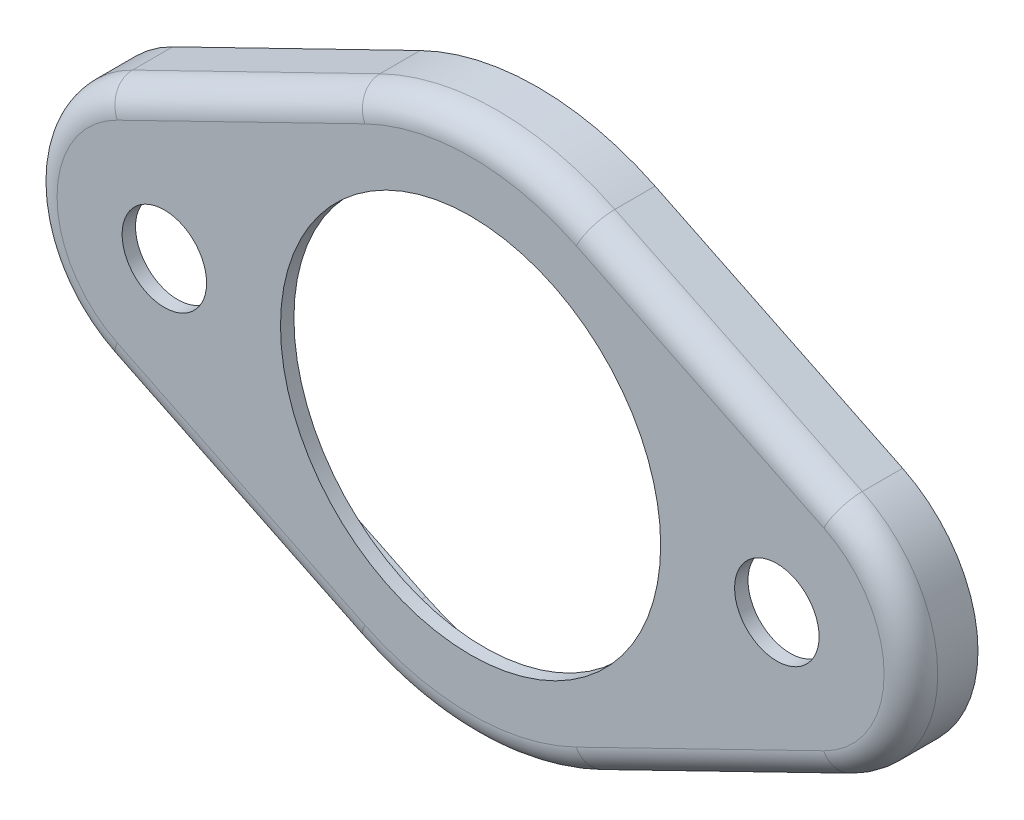
ISO-10303-21;
HEADER;
FILE_DESCRIPTION(('STEP AP214'),'2;1');
FILE_NAME('part.step','',(''),(''),'','','');
FILE_SCHEMA(('AUTOMOTIVE_DESIGN { 1 0 10303 214 1 1 1 1 }'));
ENDSEC;
DATA;
#1=APPLICATION_CONTEXT('core data for automotive mechanical design processes');
#2=APPLICATION_PROTOCOL_DEFINITION('international standard','automotive_design',2000,#1);
#3=PRODUCT_CONTEXT('',#1,'mechanical');
#4=PRODUCT('Part','Part','',(#3));
#5=PRODUCT_RELATED_PRODUCT_CATEGORY('part','',(#4));
#6=PRODUCT_DEFINITION_FORMATION('','',#4);
#7=PRODUCT_DEFINITION_CONTEXT('part definition',#1,'design');
#8=PRODUCT_DEFINITION('design','',#6,#7);
#9=PRODUCT_DEFINITION_SHAPE('','',#8);
#10=(LENGTH_UNIT() NAMED_UNIT(*) SI_UNIT(.MILLI.,.METRE.));
#11=(NAMED_UNIT(*) PLANE_ANGLE_UNIT() SI_UNIT($,.RADIAN.));
#12=(NAMED_UNIT(*) SI_UNIT($,.STERADIAN.) SOLID_ANGLE_UNIT());
#13=UNCERTAINTY_MEASURE_WITH_UNIT(LENGTH_MEASURE(1.E-05),#10,'distance_accuracy_value','');
#14=(GEOMETRIC_REPRESENTATION_CONTEXT(3) GLOBAL_UNCERTAINTY_ASSIGNED_CONTEXT((#13)) GLOBAL_UNIT_ASSIGNED_CONTEXT((#10,
#11,#12)) REPRESENTATION_CONTEXT('',''));
#15=CARTESIAN_POINT('',(0.,0.,0.));
#16=DIRECTION('',(0.,0.,1.));
#17=DIRECTION('',(1.,0.,0.));
#18=AXIS2_PLACEMENT_3D('',#15,#16,#17);
#19=CARTESIAN_POINT('',(-29.,0.,6.35));
#20=DIRECTION('',(0.,0.,-1.));
#21=DIRECTION('',(-1.,0.,0.));
#22=AXIS2_PLACEMENT_3D('',#19,#20,#21);
#23=CYLINDRICAL_SURFACE('',#22,4.);
#24=CARTESIAN_POINT('',(-29.,0.,6.35));
#25=DIRECTION('',(0.,0.,1.));
#26=DIRECTION('',(1.,0.,0.));
#27=AXIS2_PLACEMENT_3D('',#24,#25,#26);
#28=CIRCLE('',#27,4.);
#29=CARTESIAN_POINT('',(-25.,0.,6.35));
#30=VERTEX_POINT('',#29);
#31=EDGE_CURVE('E261',#30,#30,#28,.T.);
#32=ORIENTED_EDGE('',*,*,#31,.T.);
#33=EDGE_LOOP('',(#32));
#34=FACE_BOUND('',#33,.T.);
#35=CARTESIAN_POINT('',(-29.,0.,5.08));
#36=DIRECTION('',(0.,0.,-1.));
#37=DIRECTION('',(-1.,0.,0.));
#38=AXIS2_PLACEMENT_3D('',#35,#36,#37);
#39=CIRCLE('',#38,4.);
#40=CARTESIAN_POINT('',(-33.,0.,5.08));
#41=VERTEX_POINT('',#40);
#42=EDGE_CURVE('E252',#41,#41,#39,.T.);
#43=ORIENTED_EDGE('',*,*,#42,.T.);
#44=EDGE_LOOP('',(#43));
#45=FACE_BOUND('',#44,.T.);
#46=ADVANCED_FACE('F38',(#34,#45),#23,.F.);
#47=CARTESIAN_POINT('',(29.,0.,6.35));
#48=DIRECTION('',(0.,0.,-1.));
#49=DIRECTION('',(-1.,0.,0.));
#50=AXIS2_PLACEMENT_3D('',#47,#48,#49);
#51=CYLINDRICAL_SURFACE('',#50,4.);
#52=CARTESIAN_POINT('',(29.,0.,6.35));
#53=DIRECTION('',(0.,0.,1.));
#54=DIRECTION('',(1.,0.,0.));
#55=AXIS2_PLACEMENT_3D('',#52,#53,#54);
#56=CIRCLE('',#55,4.);
#57=CARTESIAN_POINT('',(33.,0.,6.35));
#58=VERTEX_POINT('',#57);
#59=EDGE_CURVE('E258',#58,#58,#56,.T.);
#60=ORIENTED_EDGE('',*,*,#59,.T.);
#61=EDGE_LOOP('',(#60));
#62=FACE_BOUND('',#61,.T.);
#63=CARTESIAN_POINT('',(29.,0.,5.08));
#64=DIRECTION('',(0.,0.,-1.));
#65=DIRECTION('',(-1.,0.,0.));
#66=AXIS2_PLACEMENT_3D('',#63,#64,#65);
#67=CIRCLE('',#66,4.);
#68=CARTESIAN_POINT('',(25.,0.,5.08));
#69=VERTEX_POINT('',#68);
#70=EDGE_CURVE('E249',#69,#69,#67,.T.);
#71=ORIENTED_EDGE('',*,*,#70,.T.);
#72=EDGE_LOOP('',(#71));
#73=FACE_BOUND('',#72,.T.);
#74=ADVANCED_FACE('F479',(#62,#73),#51,.F.);
#75=CARTESIAN_POINT('',(0.,0.,6.35));
#76=DIRECTION('',(0.,0.,-1.));
#77=DIRECTION('',(-1.,0.,0.));
#78=AXIS2_PLACEMENT_3D('',#75,#76,#77);
#79=CYLINDRICAL_SURFACE('',#78,18.0000000000007);
#80=CARTESIAN_POINT('',(0.,0.,6.35));
#81=DIRECTION('',(0.,0.,1.));
#82=DIRECTION('',(1.,0.,0.));
#83=AXIS2_PLACEMENT_3D('',#80,#81,#82);
#84=CIRCLE('',#83,18.0000000000007);
#85=CARTESIAN_POINT('',(18.0000000000007,0.,6.35));
#86=VERTEX_POINT('',#85);
#87=EDGE_CURVE('E255',#86,#86,#84,.T.);
#88=ORIENTED_EDGE('',*,*,#87,.T.);
#89=EDGE_LOOP('',(#88));
#90=FACE_BOUND('',#89,.T.);
#91=CARTESIAN_POINT('',(0.,0.,5.08));
#92=DIRECTION('',(0.,0.,-1.));
#93=DIRECTION('',(-1.,0.,0.));
#94=AXIS2_PLACEMENT_3D('',#91,#92,#93);
#95=CIRCLE('',#94,18.0000000000007);
#96=CARTESIAN_POINT('',(-18.0000000000007,0.,5.08));
#97=VERTEX_POINT('',#96);
#98=EDGE_CURVE('E238',#97,#97,#95,.T.);
#99=ORIENTED_EDGE('',*,*,#98,.T.);
#100=EDGE_LOOP('',(#99));
#101=FACE_BOUND('',#100,.T.);
#102=ADVANCED_FACE('F485',(#90,#101),#79,.F.);
#103=CARTESIAN_POINT('',(0.,0.,6.35));
#104=DIRECTION('',(0.,0.,-1.));
#105=DIRECTION('',(-1.,0.,0.));
#106=AXIS2_PLACEMENT_3D('',#103,#104,#105);
#107=PLANE('',#106);
#108=CARTESIAN_POINT('',(29.,0.,6.35));
#109=DIRECTION('',(0.,0.,-1.));
#110=DIRECTION('',(-1.,0.,0.));
#111=AXIS2_PLACEMENT_3D('',#108,#109,#110);
#112=CIRCLE('',#111,10.16);
#113=CARTESIAN_POINT('',(33.4493793103448,-9.13392707178436,6.35));
#114=VERTEX_POINT('',#113);
#115=CARTESIAN_POINT('',(33.4493793103448,9.13392707178437,6.35));
#116=VERTEX_POINT('',#115);
#117=EDGE_CURVE('E318',#114,#116,#112,.F.);
#118=ORIENTED_EDGE('',*,*,#117,.T.);
#119=DIRECTION('',(-0.899008570057517,0.437931034482759,0.));
#120=VECTOR('',#119,1.);
#121=CARTESIAN_POINT('',(10.0111034482759,20.5513359115148,6.35));
#122=LINE('',#121,#120);
#123=CARTESIAN_POINT('',(10.0111034482759,20.5513359115148,6.35));
#124=VERTEX_POINT('',#123);
#125=EDGE_CURVE('E320',#116,#124,#122,.T.);
#126=ORIENTED_EDGE('',*,*,#125,.T.);
#127=CARTESIAN_POINT('',(0.,0.,6.35));
#128=DIRECTION('',(0.,0.,-1.));
#129=DIRECTION('',(-1.,0.,0.));
#130=AXIS2_PLACEMENT_3D('',#127,#128,#129);
#131=CIRCLE('',#130,22.86);
#132=CARTESIAN_POINT('',(-10.0111034482759,20.5513359115148,6.35));
#133=VERTEX_POINT('',#132);
#134=EDGE_CURVE('E304',#124,#133,#131,.F.);
#135=ORIENTED_EDGE('',*,*,#134,.T.);
#136=DIRECTION('',(-0.899008570057517,-0.437931034482759,0.));
#137=VECTOR('',#136,1.);
#138=CARTESIAN_POINT('',(-10.0111034482759,20.5513359115148,6.35));
#139=LINE('',#138,#137);
#140=CARTESIAN_POINT('',(-33.4493793103448,9.13392707178436,6.35));
#141=VERTEX_POINT('',#140);
#142=EDGE_CURVE('E308',#133,#141,#139,.T.);
#143=ORIENTED_EDGE('',*,*,#142,.T.);
#144=CARTESIAN_POINT('',(-29.,0.,6.35));
#145=DIRECTION('',(0.,0.,-1.));
#146=DIRECTION('',(-1.,0.,0.));
#147=AXIS2_PLACEMENT_3D('',#144,#145,#146);
#148=CIRCLE('',#147,10.16);
#149=CARTESIAN_POINT('',(-33.4493793103448,-9.13392707178437,6.35));
#150=VERTEX_POINT('',#149);
#151=EDGE_CURVE('E310',#141,#150,#148,.F.);
#152=ORIENTED_EDGE('',*,*,#151,.T.);
#153=DIRECTION('',(0.899008570057517,-0.437931034482758,0.));
#154=VECTOR('',#153,1.);
#155=CARTESIAN_POINT('',(-10.0111034482759,-20.5513359115148,6.35));
#156=LINE('',#155,#154);
#157=CARTESIAN_POINT('',(-10.0111034482759,-20.5513359115148,6.35));
#158=VERTEX_POINT('',#157);
#159=EDGE_CURVE('E312',#150,#158,#156,.T.);
#160=ORIENTED_EDGE('',*,*,#159,.T.);
#161=CARTESIAN_POINT('',(0.,0.,6.35));
#162=DIRECTION('',(0.,0.,-1.));
#163=DIRECTION('',(-1.,0.,0.));
#164=AXIS2_PLACEMENT_3D('',#161,#162,#163);
#165=CIRCLE('',#164,22.86);
#166=CARTESIAN_POINT('',(10.0111034482759,-20.5513359115148,6.35));
#167=VERTEX_POINT('',#166);
#168=EDGE_CURVE('E314',#158,#167,#165,.F.);
#169=ORIENTED_EDGE('',*,*,#168,.T.);
#170=DIRECTION('',(0.899008570057517,0.437931034482759,0.));
#171=VECTOR('',#170,1.);
#172=CARTESIAN_POINT('',(10.0111034482759,-20.5513359115148,6.35));
#173=LINE('',#172,#171);
#174=EDGE_CURVE('E316',#167,#114,#173,.T.);
#175=ORIENTED_EDGE('',*,*,#174,.T.);
#176=EDGE_LOOP('',(#118,#126,#135,#143,#152,#160,#169,#175));
#177=FACE_BOUND('',#176,.T.);
#178=ORIENTED_EDGE('',*,*,#59,.F.);
#179=EDGE_LOOP('',(#178));
#180=FACE_BOUND('',#179,.T.);
#181=ORIENTED_EDGE('',*,*,#31,.F.);
#182=EDGE_LOOP('',(#181));
#183=FACE_BOUND('',#182,.T.);
#184=ORIENTED_EDGE('',*,*,#87,.F.);
#185=EDGE_LOOP('',(#184));
#186=FACE_BOUND('',#185,.T.);
#187=ADVANCED_FACE('F491',(#177,#180,#183,#186),#107,.F.);
#188=CARTESIAN_POINT('',(0.,0.,0.));
#189=DIRECTION('',(0.,0.,-1.));
#190=DIRECTION('',(-1.,0.,0.));
#191=AXIS2_PLACEMENT_3D('',#188,#189,#190);
#192=PLANE('',#191);
#193=CARTESIAN_POINT('',(0.,0.,0.));
#194=DIRECTION('',(0.,0.,-1.));
#195=DIRECTION('',(-1.,0.,0.));
#196=AXIS2_PLACEMENT_3D('',#193,#194,#195);
#197=CIRCLE('',#196,24.13);
#198=CARTESIAN_POINT('',(-10.567275862069,21.6930767954879,0.));
#199=VERTEX_POINT('',#198);
#200=CARTESIAN_POINT('',(10.567275862069,21.6930767954879,0.));
#201=VERTEX_POINT('',#200);
#202=EDGE_CURVE('E213',#199,#201,#197,.T.);
#203=ORIENTED_EDGE('',*,*,#202,.F.);
#204=DIRECTION('',(0.899008570057517,0.437931034482759,0.));
#205=VECTOR('',#204,1.);
#206=CARTESIAN_POINT('',(-34.0055517241379,10.2756679557574,0.));
#207=LINE('',#206,#205);
#208=CARTESIAN_POINT('',(-34.0055517241379,10.2756679557574,0.));
#209=VERTEX_POINT('',#208);
#210=EDGE_CURVE('E233',#209,#199,#207,.T.);
#211=ORIENTED_EDGE('',*,*,#210,.F.);
#212=CARTESIAN_POINT('',(-29.,0.,0.));
#213=DIRECTION('',(0.,0.,-1.));
#214=DIRECTION('',(-1.,0.,0.));
#215=AXIS2_PLACEMENT_3D('',#212,#213,#214);
#216=CIRCLE('',#215,11.43);
#217=CARTESIAN_POINT('',(-34.0055517241379,-10.2756679557574,0.));
#218=VERTEX_POINT('',#217);
#219=EDGE_CURVE('E230',#218,#209,#216,.T.);
#220=ORIENTED_EDGE('',*,*,#219,.F.);
#221=DIRECTION('',(-0.899008570057517,0.437931034482758,0.));
#222=VECTOR('',#221,1.);
#223=CARTESIAN_POINT('',(-10.567275862069,-21.6930767954879,0.));
#224=LINE('',#223,#222);
#225=CARTESIAN_POINT('',(-10.567275862069,-21.6930767954879,0.));
#226=VERTEX_POINT('',#225);
#227=EDGE_CURVE('E227',#226,#218,#224,.T.);
#228=ORIENTED_EDGE('',*,*,#227,.F.);
#229=CARTESIAN_POINT('',(0.,0.,0.));
#230=DIRECTION('',(0.,0.,-1.));
#231=DIRECTION('',(-1.,0.,0.));
#232=AXIS2_PLACEMENT_3D('',#229,#230,#231);
#233=CIRCLE('',#232,24.13);
#234=CARTESIAN_POINT('',(10.567275862069,-21.6930767954879,0.));
#235=VERTEX_POINT('',#234);
#236=EDGE_CURVE('E221',#235,#226,#233,.T.);
#237=ORIENTED_EDGE('',*,*,#236,.F.);
#238=DIRECTION('',(-0.899008570057517,-0.437931034482758,0.));
#239=VECTOR('',#238,1.);
#240=CARTESIAN_POINT('',(34.0055517241379,-10.2756679557574,0.));
#241=LINE('',#240,#239);
#242=CARTESIAN_POINT('',(34.0055517241379,-10.2756679557574,0.));
#243=VERTEX_POINT('',#242);
#244=EDGE_CURVE('E219',#243,#235,#241,.T.);
#245=ORIENTED_EDGE('',*,*,#244,.F.);
#246=CARTESIAN_POINT('',(29.,0.,0.));
#247=DIRECTION('',(0.,0.,-1.));
#248=DIRECTION('',(-1.,0.,0.));
#249=AXIS2_PLACEMENT_3D('',#246,#247,#248);
#250=CIRCLE('',#249,11.43);
#251=CARTESIAN_POINT('',(34.0055517241379,10.2756679557574,0.));
#252=VERTEX_POINT('',#251);
#253=EDGE_CURVE('E202',#252,#243,#250,.T.);
#254=ORIENTED_EDGE('',*,*,#253,.F.);
#255=DIRECTION('',(0.899008570057517,-0.437931034482759,0.));
#256=VECTOR('',#255,1.);
#257=CARTESIAN_POINT('',(10.567275862069,21.6930767954879,0.));
#258=LINE('',#257,#256);
#259=EDGE_CURVE('E208',#201,#252,#258,.T.);
#260=ORIENTED_EDGE('',*,*,#259,.F.);
#261=EDGE_LOOP('',(#203,#211,#220,#228,#237,#245,#254,#260));
#262=FACE_BOUND('',#261,.T.);
#263=CARTESIAN_POINT('',(0.,0.,0.));
#264=DIRECTION('',(0.,0.,1.));
#265=DIRECTION('',(-1.,0.,0.));
#266=AXIS2_PLACEMENT_3D('',#263,#264,#265);
#267=CIRCLE('',#266,25.4);
#268=CARTESIAN_POINT('',(11.1234482758621,22.8348176794609,0.));
#269=VERTEX_POINT('',#268);
#270=CARTESIAN_POINT('',(-11.1234482758621,22.8348176794609,0.));
#271=VERTEX_POINT('',#270);
#272=EDGE_CURVE('E264',#269,#271,#267,.T.);
#273=ORIENTED_EDGE('',*,*,#272,.F.);
#274=DIRECTION('',(-0.899008570057517,0.437931034482758,0.));
#275=VECTOR('',#274,1.);
#276=CARTESIAN_POINT('',(11.1234482758621,22.8348176794609,0.));
#277=LINE('',#276,#275);
#278=CARTESIAN_POINT('',(34.561724137931,11.4174088397305,0.));
#279=VERTEX_POINT('',#278);
#280=EDGE_CURVE('E285',#279,#269,#277,.T.);
#281=ORIENTED_EDGE('',*,*,#280,.F.);
#282=CARTESIAN_POINT('',(29.,0.,0.));
#283=DIRECTION('',(0.,0.,1.));
#284=DIRECTION('',(-1.,0.,0.));
#285=AXIS2_PLACEMENT_3D('',#282,#283,#284);
#286=CIRCLE('',#285,12.7);
#287=CARTESIAN_POINT('',(34.561724137931,-11.4174088397305,0.));
#288=VERTEX_POINT('',#287);
#289=EDGE_CURVE('E282',#288,#279,#286,.T.);
#290=ORIENTED_EDGE('',*,*,#289,.F.);
#291=DIRECTION('',(0.899008570057517,0.437931034482759,0.));
#292=VECTOR('',#291,1.);
#293=CARTESIAN_POINT('',(34.561724137931,-11.4174088397305,0.));
#294=LINE('',#293,#292);
#295=CARTESIAN_POINT('',(11.1234482758621,-22.8348176794609,0.));
#296=VERTEX_POINT('',#295);
#297=EDGE_CURVE('E279',#296,#288,#294,.T.);
#298=ORIENTED_EDGE('',*,*,#297,.F.);
#299=CARTESIAN_POINT('',(0.,0.,0.));
#300=DIRECTION('',(0.,0.,1.));
#301=DIRECTION('',(1.,0.,0.));
#302=AXIS2_PLACEMENT_3D('',#299,#300,#301);
#303=CIRCLE('',#302,25.4);
#304=CARTESIAN_POINT('',(-11.1234482758621,-22.8348176794609,0.));
#305=VERTEX_POINT('',#304);
#306=EDGE_CURVE('E276',#305,#296,#303,.T.);
#307=ORIENTED_EDGE('',*,*,#306,.F.);
#308=DIRECTION('',(0.899008570057517,-0.437931034482758,0.));
#309=VECTOR('',#308,1.);
#310=CARTESIAN_POINT('',(-11.1234482758621,-22.8348176794609,0.));
#311=LINE('',#310,#309);
#312=CARTESIAN_POINT('',(-34.561724137931,-11.4174088397305,0.));
#313=VERTEX_POINT('',#312);
#314=EDGE_CURVE('E273',#313,#305,#311,.T.);
#315=ORIENTED_EDGE('',*,*,#314,.F.);
#316=CARTESIAN_POINT('',(-29.,0.,0.));
#317=DIRECTION('',(0.,0.,1.));
#318=DIRECTION('',(1.,0.,0.));
#319=AXIS2_PLACEMENT_3D('',#316,#317,#318);
#320=CIRCLE('',#319,12.7);
#321=CARTESIAN_POINT('',(-34.561724137931,11.4174088397305,0.));
#322=VERTEX_POINT('',#321);
#323=EDGE_CURVE('E270',#322,#313,#320,.T.);
#324=ORIENTED_EDGE('',*,*,#323,.F.);
#325=DIRECTION('',(-0.899008570057517,-0.437931034482759,0.));
#326=VECTOR('',#325,1.);
#327=CARTESIAN_POINT('',(-34.561724137931,11.4174088397305,0.));
#328=LINE('',#327,#326);
#329=EDGE_CURVE('E267',#271,#322,#328,.T.);
#330=ORIENTED_EDGE('',*,*,#329,.F.);
#331=EDGE_LOOP('',(#273,#281,#290,#298,#307,#315,#324,#330));
#332=FACE_BOUND('',#331,.T.);
#333=ADVANCED_FACE('F215',(#262,#332),#192,.T.);
#334=CARTESIAN_POINT('',(0.,0.,6.35));
#335=DIRECTION('',(0.,0.,-1.));
#336=DIRECTION('',(-1.,0.,0.));
#337=AXIS2_PLACEMENT_3D('',#334,#335,#336);
#338=CYLINDRICAL_SURFACE('',#337,25.4);
#339=DIRECTION('',(0.,0.,-1.));
#340=VECTOR('',#339,1.);
#341=CARTESIAN_POINT('',(-11.1234482758621,22.8348176794609,6.35));
#342=LINE('',#341,#340);
#343=CARTESIAN_POINT('',(-11.1234482758621,22.8348176794609,3.81));
#344=VERTEX_POINT('',#343);
#345=EDGE_CURVE('E302',#344,#271,#342,.T.);
#346=ORIENTED_EDGE('',*,*,#345,.F.);
#347=CARTESIAN_POINT('',(0.,0.,3.81));
#348=DIRECTION('',(0.,0.,-1.));
#349=DIRECTION('',(-1.,0.,0.));
#350=AXIS2_PLACEMENT_3D('',#347,#348,#349);
#351=CIRCLE('',#350,25.4);
#352=CARTESIAN_POINT('',(11.1234482758621,22.8348176794609,3.81));
#353=VERTEX_POINT('',#352);
#354=EDGE_CURVE('E47',#344,#353,#351,.T.);
#355=ORIENTED_EDGE('',*,*,#354,.T.);
#356=DIRECTION('',(0.,0.,-1.));
#357=VECTOR('',#356,1.);
#358=CARTESIAN_POINT('',(11.1234482758621,22.8348176794609,6.35));
#359=LINE('',#358,#357);
#360=EDGE_CURVE('E288',#353,#269,#359,.T.);
#361=ORIENTED_EDGE('',*,*,#360,.T.);
#362=ORIENTED_EDGE('',*,*,#272,.T.);
#363=EDGE_LOOP('',(#346,#355,#361,#362));
#364=FACE_BOUND('',#363,.T.);
#365=ADVANCED_FACE('F497',(#364),#338,.T.);
#366=CARTESIAN_POINT('',(-34.561724137931,11.4174088397305,6.35));
#367=DIRECTION('',(0.437931034482759,-0.899008570057517,0.));
#368=DIRECTION('',(0.899008570057517,0.437931034482759,0.));
#369=AXIS2_PLACEMENT_3D('',#366,#367,#368);
#370=PLANE('',#369);
#371=DIRECTION('',(0.,0.,-1.));
#372=VECTOR('',#371,1.);
#373=CARTESIAN_POINT('',(-34.561724137931,11.4174088397305,6.35));
#374=LINE('',#373,#372);
#375=CARTESIAN_POINT('',(-34.561724137931,11.4174088397305,3.81));
#376=VERTEX_POINT('',#375);
#377=EDGE_CURVE('E300',#376,#322,#374,.T.);
#378=ORIENTED_EDGE('',*,*,#377,.F.);
#379=DIRECTION('',(-0.899008570057517,-0.437931034482759,0.));
#380=VECTOR('',#379,1.);
#381=CARTESIAN_POINT('',(-34.561724137931,11.4174088397305,3.81));
#382=LINE('',#381,#380);
#383=EDGE_CURVE('E336',#376,#344,#382,.F.);
#384=ORIENTED_EDGE('',*,*,#383,.T.);
#385=ORIENTED_EDGE('',*,*,#345,.T.);
#386=ORIENTED_EDGE('',*,*,#329,.T.);
#387=EDGE_LOOP('',(#378,#384,#385,#386));
#388=FACE_BOUND('',#387,.T.);
#389=ADVANCED_FACE('F521',(#388),#370,.F.);
#390=CARTESIAN_POINT('',(-29.,0.,6.35));
#391=DIRECTION('',(0.,0.,-1.));
#392=DIRECTION('',(-1.,0.,0.));
#393=AXIS2_PLACEMENT_3D('',#390,#391,#392);
#394=CYLINDRICAL_SURFACE('',#393,12.7);
#395=DIRECTION('',(0.,0.,-1.));
#396=VECTOR('',#395,1.);
#397=CARTESIAN_POINT('',(-34.561724137931,-11.4174088397305,6.35));
#398=LINE('',#397,#396);
#399=CARTESIAN_POINT('',(-34.561724137931,-11.4174088397305,3.81));
#400=VERTEX_POINT('',#399);
#401=EDGE_CURVE('E298',#400,#313,#398,.T.);
#402=ORIENTED_EDGE('',*,*,#401,.F.);
#403=CARTESIAN_POINT('',(-29.,0.,3.81));
#404=DIRECTION('',(0.,0.,-1.));
#405=DIRECTION('',(-1.,0.,0.));
#406=AXIS2_PLACEMENT_3D('',#403,#404,#405);
#407=CIRCLE('',#406,12.7);
#408=EDGE_CURVE('E334',#400,#376,#407,.T.);
#409=ORIENTED_EDGE('',*,*,#408,.T.);
#410=ORIENTED_EDGE('',*,*,#377,.T.);
#411=ORIENTED_EDGE('',*,*,#323,.T.);
#412=EDGE_LOOP('',(#402,#409,#410,#411));
#413=FACE_BOUND('',#412,.T.);
#414=ADVANCED_FACE('F517',(#413),#394,.T.);
#415=CARTESIAN_POINT('',(-11.1234482758621,-22.8348176794609,6.35));
#416=DIRECTION('',(0.437931034482758,0.899008570057517,0.));
#417=DIRECTION('',(-0.899008570057517,0.437931034482758,0.));
#418=AXIS2_PLACEMENT_3D('',#415,#416,#417);
#419=PLANE('',#418);
#420=DIRECTION('',(0.,0.,-1.));
#421=VECTOR('',#420,1.);
#422=CARTESIAN_POINT('',(-11.1234482758621,-22.8348176794609,6.35));
#423=LINE('',#422,#421);
#424=CARTESIAN_POINT('',(-11.1234482758621,-22.8348176794609,3.81));
#425=VERTEX_POINT('',#424);
#426=EDGE_CURVE('E296',#425,#305,#423,.T.);
#427=ORIENTED_EDGE('',*,*,#426,.F.);
#428=DIRECTION('',(0.899008570057517,-0.437931034482758,0.));
#429=VECTOR('',#428,1.);
#430=CARTESIAN_POINT('',(-11.1234482758621,-22.8348176794609,3.81));
#431=LINE('',#430,#429);
#432=EDGE_CURVE('E332',#425,#400,#431,.F.);
#433=ORIENTED_EDGE('',*,*,#432,.T.);
#434=ORIENTED_EDGE('',*,*,#401,.T.);
#435=ORIENTED_EDGE('',*,*,#314,.T.);
#436=EDGE_LOOP('',(#427,#433,#434,#435));
#437=FACE_BOUND('',#436,.T.);
#438=ADVANCED_FACE('F513',(#437),#419,.F.);
#439=CARTESIAN_POINT('',(0.,0.,6.35));
#440=DIRECTION('',(0.,0.,-1.));
#441=DIRECTION('',(-1.,0.,0.));
#442=AXIS2_PLACEMENT_3D('',#439,#440,#441);
#443=CYLINDRICAL_SURFACE('',#442,25.4);
#444=DIRECTION('',(0.,0.,-1.));
#445=VECTOR('',#444,1.);
#446=CARTESIAN_POINT('',(11.1234482758621,-22.8348176794609,6.35));
#447=LINE('',#446,#445);
#448=CARTESIAN_POINT('',(11.1234482758621,-22.8348176794609,3.81));
#449=VERTEX_POINT('',#448);
#450=EDGE_CURVE('E294',#449,#296,#447,.T.);
#451=ORIENTED_EDGE('',*,*,#450,.F.);
#452=CARTESIAN_POINT('',(0.,0.,3.81));
#453=DIRECTION('',(0.,0.,-1.));
#454=DIRECTION('',(-1.,0.,0.));
#455=AXIS2_PLACEMENT_3D('',#452,#453,#454);
#456=CIRCLE('',#455,25.4);
#457=EDGE_CURVE('E330',#449,#425,#456,.T.);
#458=ORIENTED_EDGE('',*,*,#457,.T.);
#459=ORIENTED_EDGE('',*,*,#426,.T.);
#460=ORIENTED_EDGE('',*,*,#306,.T.);
#461=EDGE_LOOP('',(#451,#458,#459,#460));
#462=FACE_BOUND('',#461,.T.);
#463=ADVANCED_FACE('F509',(#462),#443,.T.);
#464=CARTESIAN_POINT('',(34.561724137931,-11.4174088397305,6.35));
#465=DIRECTION('',(-0.437931034482759,0.899008570057517,0.));
#466=DIRECTION('',(-0.899008570057517,-0.437931034482759,0.));
#467=AXIS2_PLACEMENT_3D('',#464,#465,#466);
#468=PLANE('',#467);
#469=DIRECTION('',(0.,0.,-1.));
#470=VECTOR('',#469,1.);
#471=CARTESIAN_POINT('',(34.561724137931,-11.4174088397305,6.35));
#472=LINE('',#471,#470);
#473=CARTESIAN_POINT('',(34.561724137931,-11.4174088397305,3.81));
#474=VERTEX_POINT('',#473);
#475=EDGE_CURVE('E292',#474,#288,#472,.T.);
#476=ORIENTED_EDGE('',*,*,#475,.F.);
#477=DIRECTION('',(0.899008570057517,0.437931034482759,0.));
#478=VECTOR('',#477,1.);
#479=CARTESIAN_POINT('',(34.561724137931,-11.4174088397305,3.81));
#480=LINE('',#479,#478);
#481=EDGE_CURVE('E328',#474,#449,#480,.F.);
#482=ORIENTED_EDGE('',*,*,#481,.T.);
#483=ORIENTED_EDGE('',*,*,#450,.T.);
#484=ORIENTED_EDGE('',*,*,#297,.T.);
#485=EDGE_LOOP('',(#476,#482,#483,#484));
#486=FACE_BOUND('',#485,.T.);
#487=ADVANCED_FACE('F505',(#486),#468,.F.);
#488=CARTESIAN_POINT('',(29.,0.,6.35));
#489=DIRECTION('',(0.,0.,-1.));
#490=DIRECTION('',(-1.,0.,0.));
#491=AXIS2_PLACEMENT_3D('',#488,#489,#490);
#492=CYLINDRICAL_SURFACE('',#491,12.7);
#493=DIRECTION('',(0.,0.,-1.));
#494=VECTOR('',#493,1.);
#495=CARTESIAN_POINT('',(34.561724137931,11.4174088397305,6.35));
#496=LINE('',#495,#494);
#497=CARTESIAN_POINT('',(34.561724137931,11.4174088397305,3.81));
#498=VERTEX_POINT('',#497);
#499=EDGE_CURVE('E290',#498,#279,#496,.T.);
#500=ORIENTED_EDGE('',*,*,#499,.F.);
#501=CARTESIAN_POINT('',(29.,0.,3.81));
#502=DIRECTION('',(0.,0.,-1.));
#503=DIRECTION('',(-1.,0.,0.));
#504=AXIS2_PLACEMENT_3D('',#501,#502,#503);
#505=CIRCLE('',#504,12.7);
#506=EDGE_CURVE('E326',#498,#474,#505,.T.);
#507=ORIENTED_EDGE('',*,*,#506,.T.);
#508=ORIENTED_EDGE('',*,*,#475,.T.);
#509=ORIENTED_EDGE('',*,*,#289,.T.);
#510=EDGE_LOOP('',(#500,#507,#508,#509));
#511=FACE_BOUND('',#510,.T.);
#512=ADVANCED_FACE('F501',(#511),#492,.T.);
#513=CARTESIAN_POINT('',(11.1234482758621,22.8348176794609,6.35));
#514=DIRECTION('',(-0.437931034482758,-0.899008570057517,0.));
#515=DIRECTION('',(0.899008570057517,-0.437931034482759,0.));
#516=AXIS2_PLACEMENT_3D('',#513,#514,#515);
#517=PLANE('',#516);
#518=ORIENTED_EDGE('',*,*,#360,.F.);
#519=DIRECTION('',(-0.899008570057517,0.437931034482759,0.));
#520=VECTOR('',#519,1.);
#521=CARTESIAN_POINT('',(11.1234482758621,22.8348176794609,3.81));
#522=LINE('',#521,#520);
#523=EDGE_CURVE('E323',#353,#498,#522,.F.);
#524=ORIENTED_EDGE('',*,*,#523,.T.);
#525=ORIENTED_EDGE('',*,*,#499,.T.);
#526=ORIENTED_EDGE('',*,*,#280,.T.);
#527=EDGE_LOOP('',(#518,#524,#525,#526));
#528=FACE_BOUND('',#527,.T.);
#529=ADVANCED_FACE('F498',(#528),#517,.F.);
#530=CARTESIAN_POINT('',(0.,0.,100.516698997045));
#531=DIRECTION('',(0.,0.,-1.));
#532=DIRECTION('',(-1.,0.,0.));
#533=AXIS2_PLACEMENT_3D('',#530,#531,#532);
#534=CYLINDRICAL_SURFACE('',#533,24.13);
#535=DIRECTION('',(0.,0.,-1.));
#536=VECTOR('',#535,1.);
#537=CARTESIAN_POINT('',(10.567275862069,21.6930767954879,100.516698997045));
#538=LINE('',#537,#536);
#539=CARTESIAN_POINT('',(10.567275862069,21.6930767954879,2.54));
#540=VERTEX_POINT('',#539);
#541=EDGE_CURVE('E205',#540,#201,#538,.T.);
#542=ORIENTED_EDGE('',*,*,#541,.F.);
#543=CARTESIAN_POINT('',(0.,0.,2.54));
#544=DIRECTION('',(0.,0.,-1.));
#545=DIRECTION('',(-1.,0.,0.));
#546=AXIS2_PLACEMENT_3D('',#543,#544,#545);
#547=CIRCLE('',#546,24.13);
#548=CARTESIAN_POINT('',(-10.567275862069,21.6930767954879,2.54));
#549=VERTEX_POINT('',#548);
#550=EDGE_CURVE('E366',#540,#549,#547,.F.);
#551=ORIENTED_EDGE('',*,*,#550,.T.);
#552=DIRECTION('',(0.,0.,-1.));
#553=VECTOR('',#552,1.);
#554=CARTESIAN_POINT('',(-10.567275862069,21.6930767954879,100.516698997045));
#555=LINE('',#554,#553);
#556=EDGE_CURVE('E236',#549,#199,#555,.T.);
#557=ORIENTED_EDGE('',*,*,#556,.T.);
#558=ORIENTED_EDGE('',*,*,#202,.T.);
#559=EDGE_LOOP('',(#542,#551,#557,#558));
#560=FACE_BOUND('',#559,.T.);
#561=ADVANCED_FACE('F457',(#560),#534,.F.);
#562=CARTESIAN_POINT('',(-34.0055517241379,10.2756679557574,100.516698997045));
#563=DIRECTION('',(-0.437931034482759,0.899008570057517,0.));
#564=DIRECTION('',(-0.899008570057517,-0.437931034482759,0.));
#565=AXIS2_PLACEMENT_3D('',#562,#563,#564);
#566=PLANE('',#565);
#567=ORIENTED_EDGE('',*,*,#556,.F.);
#568=DIRECTION('',(-0.899008570057517,-0.437931034482759,0.));
#569=VECTOR('',#568,1.);
#570=CARTESIAN_POINT('',(-34.0055517241379,10.2756679557574,2.54));
#571=LINE('',#570,#569);
#572=CARTESIAN_POINT('',(-34.0055517241379,10.2756679557574,2.54));
#573=VERTEX_POINT('',#572);
#574=EDGE_CURVE('E364',#549,#573,#571,.T.);
#575=ORIENTED_EDGE('',*,*,#574,.T.);
#576=DIRECTION('',(0.,0.,-1.));
#577=VECTOR('',#576,1.);
#578=CARTESIAN_POINT('',(-34.0055517241379,10.2756679557574,100.516698997045));
#579=LINE('',#578,#577);
#580=EDGE_CURVE('E239',#573,#209,#579,.T.);
#581=ORIENTED_EDGE('',*,*,#580,.T.);
#582=ORIENTED_EDGE('',*,*,#210,.T.);
#583=EDGE_LOOP('',(#567,#575,#581,#582));
#584=FACE_BOUND('',#583,.T.);
#585=ADVANCED_FACE('F455',(#584),#566,.F.);
#586=CARTESIAN_POINT('',(-29.,0.,100.516698997045));
#587=DIRECTION('',(0.,0.,-1.));
#588=DIRECTION('',(-1.,0.,0.));
#589=AXIS2_PLACEMENT_3D('',#586,#587,#588);
#590=CYLINDRICAL_SURFACE('',#589,11.43);
#591=ORIENTED_EDGE('',*,*,#580,.F.);
#592=CARTESIAN_POINT('',(-29.,0.,2.54));
#593=DIRECTION('',(0.,0.,-1.));
#594=DIRECTION('',(-1.,0.,0.));
#595=AXIS2_PLACEMENT_3D('',#592,#593,#594);
#596=CIRCLE('',#595,11.43);
#597=CARTESIAN_POINT('',(-34.0055517241379,-10.2756679557574,2.54));
#598=VERTEX_POINT('',#597);
#599=EDGE_CURVE('E362',#573,#598,#596,.F.);
#600=ORIENTED_EDGE('',*,*,#599,.T.);
#601=DIRECTION('',(0.,0.,-1.));
#602=VECTOR('',#601,1.);
#603=CARTESIAN_POINT('',(-34.0055517241379,-10.2756679557574,100.516698997045));
#604=LINE('',#603,#602);
#605=EDGE_CURVE('E241',#598,#218,#604,.T.);
#606=ORIENTED_EDGE('',*,*,#605,.T.);
#607=ORIENTED_EDGE('',*,*,#219,.T.);
#608=EDGE_LOOP('',(#591,#600,#606,#607));
#609=FACE_BOUND('',#608,.T.);
#610=ADVANCED_FACE('F452',(#609),#590,.F.);
#611=CARTESIAN_POINT('',(-10.567275862069,-21.6930767954879,100.516698997045));
#612=DIRECTION('',(-0.437931034482758,-0.899008570057517,0.));
#613=DIRECTION('',(0.899008570057517,-0.437931034482758,0.));
#614=AXIS2_PLACEMENT_3D('',#611,#612,#613);
#615=PLANE('',#614);
#616=ORIENTED_EDGE('',*,*,#605,.F.);
#617=DIRECTION('',(0.899008570057517,-0.437931034482758,0.));
#618=VECTOR('',#617,1.);
#619=CARTESIAN_POINT('',(-10.567275862069,-21.6930767954879,2.54));
#620=LINE('',#619,#618);
#621=CARTESIAN_POINT('',(-10.567275862069,-21.6930767954879,2.54));
#622=VERTEX_POINT('',#621);
#623=EDGE_CURVE('E360',#598,#622,#620,.T.);
#624=ORIENTED_EDGE('',*,*,#623,.T.);
#625=DIRECTION('',(0.,0.,-1.));
#626=VECTOR('',#625,1.);
#627=CARTESIAN_POINT('',(-10.567275862069,-21.6930767954879,100.516698997045));
#628=LINE('',#627,#626);
#629=EDGE_CURVE('E243',#622,#226,#628,.T.);
#630=ORIENTED_EDGE('',*,*,#629,.T.);
#631=ORIENTED_EDGE('',*,*,#227,.T.);
#632=EDGE_LOOP('',(#616,#624,#630,#631));
#633=FACE_BOUND('',#632,.T.);
#634=ADVANCED_FACE('F449',(#633),#615,.F.);
#635=CARTESIAN_POINT('',(0.,0.,100.516698997045));
#636=DIRECTION('',(0.,0.,-1.));
#637=DIRECTION('',(-1.,0.,0.));
#638=AXIS2_PLACEMENT_3D('',#635,#636,#637);
#639=CYLINDRICAL_SURFACE('',#638,24.13);
#640=ORIENTED_EDGE('',*,*,#629,.F.);
#641=CARTESIAN_POINT('',(0.,0.,2.54));
#642=DIRECTION('',(0.,0.,-1.));
#643=DIRECTION('',(-1.,0.,0.));
#644=AXIS2_PLACEMENT_3D('',#641,#642,#643);
#645=CIRCLE('',#644,24.13);
#646=CARTESIAN_POINT('',(10.567275862069,-21.6930767954879,2.54));
#647=VERTEX_POINT('',#646);
#648=EDGE_CURVE('E358',#622,#647,#645,.F.);
#649=ORIENTED_EDGE('',*,*,#648,.T.);
#650=DIRECTION('',(0.,0.,-1.));
#651=VECTOR('',#650,1.);
#652=CARTESIAN_POINT('',(10.567275862069,-21.6930767954879,100.516698997045));
#653=LINE('',#652,#651);
#654=EDGE_CURVE('E245',#647,#235,#653,.T.);
#655=ORIENTED_EDGE('',*,*,#654,.T.);
#656=ORIENTED_EDGE('',*,*,#236,.T.);
#657=EDGE_LOOP('',(#640,#649,#655,#656));
#658=FACE_BOUND('',#657,.T.);
#659=ADVANCED_FACE('F441',(#658),#639,.F.);
#660=CARTESIAN_POINT('',(34.0055517241379,-10.2756679557574,100.516698997045));
#661=DIRECTION('',(0.437931034482758,-0.899008570057517,0.));
#662=DIRECTION('',(0.899008570057517,0.437931034482758,0.));
#663=AXIS2_PLACEMENT_3D('',#660,#661,#662);
#664=PLANE('',#663);
#665=ORIENTED_EDGE('',*,*,#654,.F.);
#666=DIRECTION('',(0.899008570057517,0.437931034482758,0.));
#667=VECTOR('',#666,1.);
#668=CARTESIAN_POINT('',(34.0055517241379,-10.2756679557574,2.54));
#669=LINE('',#668,#667);
#670=CARTESIAN_POINT('',(34.0055517241379,-10.2756679557574,2.54));
#671=VERTEX_POINT('',#670);
#672=EDGE_CURVE('E338',#647,#671,#669,.T.);
#673=ORIENTED_EDGE('',*,*,#672,.T.);
#674=DIRECTION('',(0.,0.,-1.));
#675=VECTOR('',#674,1.);
#676=CARTESIAN_POINT('',(34.0055517241379,-10.2756679557574,100.516698997045));
#677=LINE('',#676,#675);
#678=EDGE_CURVE('E204',#671,#243,#677,.T.);
#679=ORIENTED_EDGE('',*,*,#678,.T.);
#680=ORIENTED_EDGE('',*,*,#244,.T.);
#681=EDGE_LOOP('',(#665,#673,#679,#680));
#682=FACE_BOUND('',#681,.T.);
#683=ADVANCED_FACE('F443',(#682),#664,.F.);
#684=CARTESIAN_POINT('',(29.,0.,100.516698997045));
#685=DIRECTION('',(0.,0.,-1.));
#686=DIRECTION('',(-1.,0.,0.));
#687=AXIS2_PLACEMENT_3D('',#684,#685,#686);
#688=CYLINDRICAL_SURFACE('',#687,11.43);
#689=ORIENTED_EDGE('',*,*,#678,.F.);
#690=CARTESIAN_POINT('',(29.,0.,2.54));
#691=DIRECTION('',(0.,0.,-1.));
#692=DIRECTION('',(-1.,0.,0.));
#693=AXIS2_PLACEMENT_3D('',#690,#691,#692);
#694=CIRCLE('',#693,11.43);
#695=CARTESIAN_POINT('',(34.0055517241379,10.2756679557574,2.54));
#696=VERTEX_POINT('',#695);
#697=EDGE_CURVE('E12',#671,#696,#694,.F.);
#698=ORIENTED_EDGE('',*,*,#697,.T.);
#699=DIRECTION('',(0.,0.,-1.));
#700=VECTOR('',#699,1.);
#701=CARTESIAN_POINT('',(34.0055517241379,10.2756679557574,100.516698997045));
#702=LINE('',#701,#700);
#703=EDGE_CURVE('E198',#696,#252,#702,.T.);
#704=ORIENTED_EDGE('',*,*,#703,.T.);
#705=ORIENTED_EDGE('',*,*,#253,.T.);
#706=EDGE_LOOP('',(#689,#698,#704,#705));
#707=FACE_BOUND('',#706,.T.);
#708=ADVANCED_FACE('F200',(#707),#688,.F.);
#709=CARTESIAN_POINT('',(10.567275862069,21.6930767954879,100.516698997045));
#710=DIRECTION('',(0.437931034482759,0.899008570057517,0.));
#711=DIRECTION('',(-0.899008570057517,0.437931034482759,0.));
#712=AXIS2_PLACEMENT_3D('',#709,#710,#711);
#713=PLANE('',#712);
#714=ORIENTED_EDGE('',*,*,#703,.F.);
#715=DIRECTION('',(-0.899008570057517,0.437931034482759,0.));
#716=VECTOR('',#715,1.);
#717=CARTESIAN_POINT('',(10.567275862069,21.6930767954879,2.54));
#718=LINE('',#717,#716);
#719=EDGE_CURVE('E60',#696,#540,#718,.T.);
#720=ORIENTED_EDGE('',*,*,#719,.T.);
#721=ORIENTED_EDGE('',*,*,#541,.T.);
#722=ORIENTED_EDGE('',*,*,#259,.T.);
#723=EDGE_LOOP('',(#714,#720,#721,#722));
#724=FACE_BOUND('',#723,.T.);
#725=ADVANCED_FACE('F209',(#724),#713,.F.);
#726=CARTESIAN_POINT('',(0.,0.,5.08));
#727=DIRECTION('',(0.,0.,-1.));
#728=DIRECTION('',(-1.,0.,0.));
#729=AXIS2_PLACEMENT_3D('',#726,#727,#728);
#730=PLANE('',#729);
#731=CARTESIAN_POINT('',(29.,0.,5.08));
#732=DIRECTION('',(0.,0.,-1.));
#733=DIRECTION('',(-1.,0.,0.));
#734=AXIS2_PLACEMENT_3D('',#731,#732,#733);
#735=CIRCLE('',#734,8.89);
#736=CARTESIAN_POINT('',(32.8932068965517,7.99218618781132,5.08));
#737=VERTEX_POINT('',#736);
#738=CARTESIAN_POINT('',(32.8932068965517,-7.99218618781133,5.08));
#739=VERTEX_POINT('',#738);
#740=EDGE_CURVE('E341',#737,#739,#735,.T.);
#741=ORIENTED_EDGE('',*,*,#740,.T.);
#742=DIRECTION('',(0.899008570057517,0.437931034482758,0.));
#743=VECTOR('',#742,1.);
#744=CARTESIAN_POINT('',(9.45493103448275,-19.4095950275418,5.08));
#745=LINE('',#744,#743);
#746=CARTESIAN_POINT('',(9.45493103448276,-19.4095950275418,5.08));
#747=VERTEX_POINT('',#746);
#748=EDGE_CURVE('E355',#739,#747,#745,.F.);
#749=ORIENTED_EDGE('',*,*,#748,.T.);
#750=CARTESIAN_POINT('',(0.,0.,5.08));
#751=DIRECTION('',(0.,0.,-1.));
#752=DIRECTION('',(-1.,0.,0.));
#753=AXIS2_PLACEMENT_3D('',#750,#751,#752);
#754=CIRCLE('',#753,21.59);
#755=CARTESIAN_POINT('',(-9.45493103448276,-19.4095950275418,5.08));
#756=VERTEX_POINT('',#755);
#757=EDGE_CURVE('E353',#747,#756,#754,.T.);
#758=ORIENTED_EDGE('',*,*,#757,.T.);
#759=DIRECTION('',(0.899008570057517,-0.437931034482758,0.));
#760=VECTOR('',#759,1.);
#761=CARTESIAN_POINT('',(-9.45493103448275,-19.4095950275418,5.08));
#762=LINE('',#761,#760);
#763=CARTESIAN_POINT('',(-32.8932068965517,-7.99218618781133,5.08));
#764=VERTEX_POINT('',#763);
#765=EDGE_CURVE('E351',#756,#764,#762,.F.);
#766=ORIENTED_EDGE('',*,*,#765,.T.);
#767=CARTESIAN_POINT('',(-29.,0.,5.08));
#768=DIRECTION('',(0.,0.,-1.));
#769=DIRECTION('',(-1.,0.,0.));
#770=AXIS2_PLACEMENT_3D('',#767,#768,#769);
#771=CIRCLE('',#770,8.89);
#772=CARTESIAN_POINT('',(-32.8932068965517,7.99218618781132,5.08));
#773=VERTEX_POINT('',#772);
#774=EDGE_CURVE('E349',#764,#773,#771,.T.);
#775=ORIENTED_EDGE('',*,*,#774,.T.);
#776=DIRECTION('',(-0.899008570057517,-0.437931034482759,0.));
#777=VECTOR('',#776,1.);
#778=CARTESIAN_POINT('',(-9.45493103448275,19.4095950275418,5.08));
#779=LINE('',#778,#777);
#780=CARTESIAN_POINT('',(-9.45493103448276,19.4095950275418,5.08));
#781=VERTEX_POINT('',#780);
#782=EDGE_CURVE('E347',#773,#781,#779,.F.);
#783=ORIENTED_EDGE('',*,*,#782,.T.);
#784=CARTESIAN_POINT('',(0.,0.,5.08));
#785=DIRECTION('',(0.,0.,-1.));
#786=DIRECTION('',(-1.,0.,0.));
#787=AXIS2_PLACEMENT_3D('',#784,#785,#786);
#788=CIRCLE('',#787,21.59);
#789=CARTESIAN_POINT('',(9.45493103448276,19.4095950275418,5.08));
#790=VERTEX_POINT('',#789);
#791=EDGE_CURVE('E345',#781,#790,#788,.T.);
#792=ORIENTED_EDGE('',*,*,#791,.T.);
#793=DIRECTION('',(-0.899008570057517,0.437931034482759,0.));
#794=VECTOR('',#793,1.);
#795=CARTESIAN_POINT('',(9.45493103448276,19.4095950275418,5.08));
#796=LINE('',#795,#794);
#797=EDGE_CURVE('E343',#790,#737,#796,.F.);
#798=ORIENTED_EDGE('',*,*,#797,.T.);
#799=EDGE_LOOP('',(#741,#749,#758,#766,#775,#783,#792,#798));
#800=FACE_BOUND('',#799,.T.);
#801=ORIENTED_EDGE('',*,*,#42,.F.);
#802=EDGE_LOOP('',(#801));
#803=FACE_BOUND('',#802,.T.);
#804=ORIENTED_EDGE('',*,*,#70,.F.);
#805=EDGE_LOOP('',(#804));
#806=FACE_BOUND('',#805,.T.);
#807=ORIENTED_EDGE('',*,*,#98,.F.);
#808=EDGE_LOOP('',(#807));
#809=FACE_BOUND('',#808,.T.);
#810=ADVANCED_FACE('F424',(#800,#803,#806,#809),#730,.T.);
#811=CARTESIAN_POINT('',(-10.0111034482758,-20.5513359115148,3.81));
#812=DIRECTION('',(0.899008570057517,-0.437931034482758,0.));
#813=DIRECTION('',(0.437931034482758,0.899008570057517,0.));
#814=AXIS2_PLACEMENT_3D('',#811,#812,#813);
#815=CYLINDRICAL_SURFACE('',#814,2.54);
#816=CARTESIAN_POINT('',(-33.4493793103448,-9.13392707178437,3.81));
#817=DIRECTION('',(-0.899008570057516,0.437931034482759,0.));
#818=DIRECTION('',(-0.437931034482759,-0.899008570057517,0.));
#819=AXIS2_PLACEMENT_3D('',#816,#817,#818);
#820=CIRCLE('',#819,2.54);
#821=EDGE_CURVE('E386',#400,#150,#820,.T.);
#822=ORIENTED_EDGE('',*,*,#821,.F.);
#823=ORIENTED_EDGE('',*,*,#432,.F.);
#824=CARTESIAN_POINT('',(-10.0111034482759,-20.5513359115148,3.81));
#825=DIRECTION('',(0.899008570057517,-0.437931034482759,0.));
#826=DIRECTION('',(0.437931034482759,0.899008570057517,0.));
#827=AXIS2_PLACEMENT_3D('',#824,#825,#826);
#828=CIRCLE('',#827,2.54);
#829=EDGE_CURVE('E389',#158,#425,#828,.T.);
#830=ORIENTED_EDGE('',*,*,#829,.F.);
#831=ORIENTED_EDGE('',*,*,#159,.F.);
#832=EDGE_LOOP('',(#822,#823,#830,#831));
#833=FACE_BOUND('',#832,.T.);
#834=ADVANCED_FACE('F556',(#833),#815,.T.);
#835=CARTESIAN_POINT('',(0.,0.,3.81));
#836=DIRECTION('',(0.,0.,-1.));
#837=DIRECTION('',(-1.,0.,0.));
#838=AXIS2_PLACEMENT_3D('',#835,#836,#837);
#839=TOROIDAL_SURFACE('',#838,22.86,2.54);
#840=ORIENTED_EDGE('',*,*,#829,.T.);
#841=ORIENTED_EDGE('',*,*,#457,.F.);
#842=CARTESIAN_POINT('',(10.0111034482759,-20.5513359115148,3.81));
#843=DIRECTION('',(0.899008570057517,0.437931034482759,0.));
#844=DIRECTION('',(-0.437931034482759,0.899008570057517,0.));
#845=AXIS2_PLACEMENT_3D('',#842,#843,#844);
#846=CIRCLE('',#845,2.54);
#847=EDGE_CURVE('E383',#167,#449,#846,.T.);
#848=ORIENTED_EDGE('',*,*,#847,.F.);
#849=ORIENTED_EDGE('',*,*,#168,.F.);
#850=EDGE_LOOP('',(#840,#841,#848,#849));
#851=FACE_BOUND('',#850,.T.);
#852=ADVANCED_FACE('F552',(#851),#839,.T.);
#853=CARTESIAN_POINT('',(-29.,0.,3.81));
#854=DIRECTION('',(0.,0.,-1.));
#855=DIRECTION('',(-1.,0.,0.));
#856=AXIS2_PLACEMENT_3D('',#853,#854,#855);
#857=TOROIDAL_SURFACE('',#856,10.16,2.54);
#858=ORIENTED_EDGE('',*,*,#821,.T.);
#859=ORIENTED_EDGE('',*,*,#151,.F.);
#860=CARTESIAN_POINT('',(-33.4493793103448,9.13392707178437,3.81));
#861=DIRECTION('',(0.899008570057516,0.437931034482759,0.));
#862=DIRECTION('',(-0.437931034482759,0.899008570057517,0.));
#863=AXIS2_PLACEMENT_3D('',#860,#861,#862);
#864=CIRCLE('',#863,2.54);
#865=EDGE_CURVE('E380',#376,#141,#864,.T.);
#866=ORIENTED_EDGE('',*,*,#865,.F.);
#867=ORIENTED_EDGE('',*,*,#408,.F.);
#868=EDGE_LOOP('',(#858,#859,#866,#867));
#869=FACE_BOUND('',#868,.T.);
#870=ADVANCED_FACE('F548',(#869),#857,.T.);
#871=CARTESIAN_POINT('',(10.0111034482759,-20.5513359115148,3.81));
#872=DIRECTION('',(0.899008570057517,0.437931034482759,0.));
#873=DIRECTION('',(-0.437931034482759,0.899008570057517,0.));
#874=AXIS2_PLACEMENT_3D('',#871,#872,#873);
#875=CYLINDRICAL_SURFACE('',#874,2.54);
#876=ORIENTED_EDGE('',*,*,#847,.T.);
#877=ORIENTED_EDGE('',*,*,#481,.F.);
#878=CARTESIAN_POINT('',(33.4493793103448,-9.13392707178436,3.81));
#879=DIRECTION('',(0.899008570057517,0.437931034482759,0.));
#880=DIRECTION('',(-0.437931034482759,0.899008570057517,0.));
#881=AXIS2_PLACEMENT_3D('',#878,#879,#880);
#882=CIRCLE('',#881,2.54);
#883=EDGE_CURVE('E377',#114,#474,#882,.T.);
#884=ORIENTED_EDGE('',*,*,#883,.F.);
#885=ORIENTED_EDGE('',*,*,#174,.F.);
#886=EDGE_LOOP('',(#876,#877,#884,#885));
#887=FACE_BOUND('',#886,.T.);
#888=ADVANCED_FACE('F544',(#887),#875,.T.);
#889=CARTESIAN_POINT('',(-10.0111034482759,20.5513359115148,3.81));
#890=DIRECTION('',(-0.899008570057517,-0.437931034482759,0.));
#891=DIRECTION('',(0.437931034482759,-0.899008570057517,0.));
#892=AXIS2_PLACEMENT_3D('',#889,#890,#891);
#893=CYLINDRICAL_SURFACE('',#892,2.54);
#894=ORIENTED_EDGE('',*,*,#865,.T.);
#895=ORIENTED_EDGE('',*,*,#142,.F.);
#896=CARTESIAN_POINT('',(-10.0111034482759,20.5513359115148,3.81));
#897=DIRECTION('',(0.899008570057517,0.437931034482759,0.));
#898=DIRECTION('',(-0.437931034482759,0.899008570057517,0.));
#899=AXIS2_PLACEMENT_3D('',#896,#897,#898);
#900=CIRCLE('',#899,2.54);
#901=EDGE_CURVE('E374',#344,#133,#900,.T.);
#902=ORIENTED_EDGE('',*,*,#901,.F.);
#903=ORIENTED_EDGE('',*,*,#383,.F.);
#904=EDGE_LOOP('',(#894,#895,#902,#903));
#905=FACE_BOUND('',#904,.T.);
#906=ADVANCED_FACE('F540',(#905),#893,.T.);
#907=CARTESIAN_POINT('',(29.,0.,3.81));
#908=DIRECTION('',(0.,0.,-1.));
#909=DIRECTION('',(-1.,0.,0.));
#910=AXIS2_PLACEMENT_3D('',#907,#908,#909);
#911=TOROIDAL_SURFACE('',#910,10.16,2.54);
#912=ORIENTED_EDGE('',*,*,#883,.T.);
#913=ORIENTED_EDGE('',*,*,#506,.F.);
#914=CARTESIAN_POINT('',(33.4493793103448,9.13392707178437,3.81));
#915=DIRECTION('',(-0.899008570057516,0.43793103448276,0.));
#916=DIRECTION('',(-0.43793103448276,-0.899008570057516,0.));
#917=AXIS2_PLACEMENT_3D('',#914,#915,#916);
#918=CIRCLE('',#917,2.54);
#919=EDGE_CURVE('E372',#116,#498,#918,.T.);
#920=ORIENTED_EDGE('',*,*,#919,.F.);
#921=ORIENTED_EDGE('',*,*,#117,.F.);
#922=EDGE_LOOP('',(#912,#913,#920,#921));
#923=FACE_BOUND('',#922,.T.);
#924=ADVANCED_FACE('F536',(#923),#911,.T.);
#925=CARTESIAN_POINT('',(0.,0.,3.81));
#926=DIRECTION('',(0.,0.,-1.));
#927=DIRECTION('',(-1.,0.,0.));
#928=AXIS2_PLACEMENT_3D('',#925,#926,#927);
#929=TOROIDAL_SURFACE('',#928,22.86,2.54);
#930=ORIENTED_EDGE('',*,*,#901,.T.);
#931=ORIENTED_EDGE('',*,*,#134,.F.);
#932=CARTESIAN_POINT('',(10.0111034482759,20.5513359115148,3.81));
#933=DIRECTION('',(0.899008570057517,-0.437931034482759,0.));
#934=DIRECTION('',(0.437931034482759,0.899008570057517,0.));
#935=AXIS2_PLACEMENT_3D('',#932,#933,#934);
#936=CIRCLE('',#935,2.54);
#937=EDGE_CURVE('E370',#353,#124,#936,.T.);
#938=ORIENTED_EDGE('',*,*,#937,.F.);
#939=ORIENTED_EDGE('',*,*,#354,.F.);
#940=EDGE_LOOP('',(#930,#931,#938,#939));
#941=FACE_BOUND('',#940,.T.);
#942=ADVANCED_FACE('F532',(#941),#929,.T.);
#943=CARTESIAN_POINT('',(10.0111034482759,20.5513359115148,3.81));
#944=DIRECTION('',(-0.899008570057517,0.437931034482759,0.));
#945=DIRECTION('',(-0.437931034482759,-0.899008570057517,0.));
#946=AXIS2_PLACEMENT_3D('',#943,#944,#945);
#947=CYLINDRICAL_SURFACE('',#946,2.54);
#948=ORIENTED_EDGE('',*,*,#919,.T.);
#949=ORIENTED_EDGE('',*,*,#523,.F.);
#950=ORIENTED_EDGE('',*,*,#937,.T.);
#951=ORIENTED_EDGE('',*,*,#125,.F.);
#952=EDGE_LOOP('',(#948,#949,#950,#951));
#953=FACE_BOUND('',#952,.T.);
#954=ADVANCED_FACE('F529',(#953),#947,.T.);
#955=CARTESIAN_POINT('',(-32.8932068965517,7.99218618781132,2.54));
#956=DIRECTION('',(-0.899008570057517,-0.437931034482759,0.));
#957=DIRECTION('',(0.437931034482759,-0.899008570057517,0.));
#958=AXIS2_PLACEMENT_3D('',#955,#956,#957);
#959=CYLINDRICAL_SURFACE('',#958,2.54);
#960=CARTESIAN_POINT('',(-9.45493103448276,19.4095950275418,2.54));
#961=DIRECTION('',(-0.899008570057517,-0.437931034482759,0.));
#962=DIRECTION('',(0.437931034482759,-0.899008570057517,0.));
#963=AXIS2_PLACEMENT_3D('',#960,#961,#962);
#964=CIRCLE('',#963,2.54);
#965=EDGE_CURVE('E407',#781,#549,#964,.T.);
#966=ORIENTED_EDGE('',*,*,#965,.F.);
#967=ORIENTED_EDGE('',*,*,#782,.F.);
#968=CARTESIAN_POINT('',(-32.8932068965517,7.99218618781132,2.54));
#969=DIRECTION('',(0.899008570057516,0.437931034482759,0.));
#970=DIRECTION('',(-0.437931034482759,0.899008570057516,0.));
#971=AXIS2_PLACEMENT_3D('',#968,#969,#970);
#972=CIRCLE('',#971,2.54);
#973=EDGE_CURVE('E42',#573,#773,#972,.T.);
#974=ORIENTED_EDGE('',*,*,#973,.F.);
#975=ORIENTED_EDGE('',*,*,#574,.F.);
#976=EDGE_LOOP('',(#966,#967,#974,#975));
#977=FACE_BOUND('',#976,.T.);
#978=ADVANCED_FACE('F40',(#977),#959,.F.);
#979=CARTESIAN_POINT('',(-29.,0.,2.54));
#980=DIRECTION('',(0.,0.,-1.));
#981=DIRECTION('',(-1.,0.,0.));
#982=AXIS2_PLACEMENT_3D('',#979,#980,#981);
#983=TOROIDAL_SURFACE('',#982,8.89,2.54);
#984=ORIENTED_EDGE('',*,*,#973,.T.);
#985=ORIENTED_EDGE('',*,*,#774,.F.);
#986=CARTESIAN_POINT('',(-32.8932068965517,-7.99218618781132,2.54));
#987=DIRECTION('',(-0.899008570057516,0.437931034482759,0.));
#988=DIRECTION('',(-0.437931034482759,-0.899008570057516,0.));
#989=AXIS2_PLACEMENT_3D('',#986,#987,#988);
#990=CIRCLE('',#989,2.54);
#991=EDGE_CURVE('E405',#598,#764,#990,.T.);
#992=ORIENTED_EDGE('',*,*,#991,.F.);
#993=ORIENTED_EDGE('',*,*,#599,.F.);
#994=EDGE_LOOP('',(#984,#985,#992,#993));
#995=FACE_BOUND('',#994,.T.);
#996=ADVANCED_FACE('F418',(#995),#983,.F.);
#997=CARTESIAN_POINT('',(0.,0.,2.54));
#998=DIRECTION('',(0.,0.,-1.));
#999=DIRECTION('',(-1.,0.,0.));
#1000=AXIS2_PLACEMENT_3D('',#997,#998,#999);
#1001=TOROIDAL_SURFACE('',#1000,21.59,2.54);
#1002=ORIENTED_EDGE('',*,*,#965,.T.);
#1003=ORIENTED_EDGE('',*,*,#550,.F.);
#1004=CARTESIAN_POINT('',(9.45493103448276,19.4095950275418,2.54));
#1005=DIRECTION('',(-0.899008570057517,0.437931034482759,0.));
#1006=DIRECTION('',(-0.437931034482759,-0.899008570057517,0.));
#1007=AXIS2_PLACEMENT_3D('',#1004,#1005,#1006);
#1008=CIRCLE('',#1007,2.54);
#1009=EDGE_CURVE('E402',#790,#540,#1008,.T.);
#1010=ORIENTED_EDGE('',*,*,#1009,.F.);
#1011=ORIENTED_EDGE('',*,*,#791,.F.);
#1012=EDGE_LOOP('',(#1002,#1003,#1010,#1011));
#1013=FACE_BOUND('',#1012,.T.);
#1014=ADVANCED_FACE('F458',(#1013),#1001,.F.);
#1015=CARTESIAN_POINT('',(-9.45493103448276,-19.4095950275418,2.54));
#1016=DIRECTION('',(0.899008570057517,-0.437931034482758,0.));
#1017=DIRECTION('',(0.437931034482758,0.899008570057517,0.));
#1018=AXIS2_PLACEMENT_3D('',#1015,#1016,#1017);
#1019=CYLINDRICAL_SURFACE('',#1018,2.54);
#1020=ORIENTED_EDGE('',*,*,#991,.T.);
#1021=ORIENTED_EDGE('',*,*,#765,.F.);
#1022=CARTESIAN_POINT('',(-9.45493103448276,-19.4095950275418,2.54));
#1023=DIRECTION('',(-0.899008570057517,0.437931034482758,0.));
#1024=DIRECTION('',(-0.437931034482758,-0.899008570057517,0.));
#1025=AXIS2_PLACEMENT_3D('',#1022,#1023,#1024);
#1026=CIRCLE('',#1025,2.54);
#1027=EDGE_CURVE('E399',#622,#756,#1026,.T.);
#1028=ORIENTED_EDGE('',*,*,#1027,.F.);
#1029=ORIENTED_EDGE('',*,*,#623,.F.);
#1030=EDGE_LOOP('',(#1020,#1021,#1028,#1029));
#1031=FACE_BOUND('',#1030,.T.);
#1032=ADVANCED_FACE('F431',(#1031),#1019,.F.);
#1033=CARTESIAN_POINT('',(9.45493103448276,19.4095950275418,2.54));
#1034=DIRECTION('',(-0.899008570057517,0.437931034482759,0.));
#1035=DIRECTION('',(-0.437931034482759,-0.899008570057517,0.));
#1036=AXIS2_PLACEMENT_3D('',#1033,#1034,#1035);
#1037=CYLINDRICAL_SURFACE('',#1036,2.54);
#1038=ORIENTED_EDGE('',*,*,#1009,.T.);
#1039=ORIENTED_EDGE('',*,*,#719,.F.);
#1040=CARTESIAN_POINT('',(32.8932068965517,7.99218618781132,2.54));
#1041=DIRECTION('',(-0.899008570057516,0.43793103448276,0.));
#1042=DIRECTION('',(-0.43793103448276,-0.899008570057516,0.));
#1043=AXIS2_PLACEMENT_3D('',#1040,#1041,#1042);
#1044=CIRCLE('',#1043,2.54);
#1045=EDGE_CURVE('E396',#737,#696,#1044,.T.);
#1046=ORIENTED_EDGE('',*,*,#1045,.F.);
#1047=ORIENTED_EDGE('',*,*,#797,.F.);
#1048=EDGE_LOOP('',(#1038,#1039,#1046,#1047));
#1049=FACE_BOUND('',#1048,.T.);
#1050=ADVANCED_FACE('F461',(#1049),#1037,.F.);
#1051=CARTESIAN_POINT('',(0.,0.,2.54));
#1052=DIRECTION('',(0.,0.,-1.));
#1053=DIRECTION('',(-1.,0.,0.));
#1054=AXIS2_PLACEMENT_3D('',#1051,#1052,#1053);
#1055=TOROIDAL_SURFACE('',#1054,21.59,2.54);
#1056=ORIENTED_EDGE('',*,*,#1027,.T.);
#1057=ORIENTED_EDGE('',*,*,#757,.F.);
#1058=CARTESIAN_POINT('',(9.45493103448276,-19.4095950275418,2.54));
#1059=DIRECTION('',(-0.899008570057517,-0.437931034482759,0.));
#1060=DIRECTION('',(0.437931034482759,-0.899008570057517,0.));
#1061=AXIS2_PLACEMENT_3D('',#1058,#1059,#1060);
#1062=CIRCLE('',#1061,2.54);
#1063=EDGE_CURVE('E394',#647,#747,#1062,.T.);
#1064=ORIENTED_EDGE('',*,*,#1063,.F.);
#1065=ORIENTED_EDGE('',*,*,#648,.F.);
#1066=EDGE_LOOP('',(#1056,#1057,#1064,#1065));
#1067=FACE_BOUND('',#1066,.T.);
#1068=ADVANCED_FACE('F435',(#1067),#1055,.F.);
#1069=CARTESIAN_POINT('',(29.,0.,2.54));
#1070=DIRECTION('',(0.,0.,-1.));
#1071=DIRECTION('',(-1.,0.,0.));
#1072=AXIS2_PLACEMENT_3D('',#1069,#1070,#1071);
#1073=TOROIDAL_SURFACE('',#1072,8.89,2.54);
#1074=ORIENTED_EDGE('',*,*,#1045,.T.);
#1075=ORIENTED_EDGE('',*,*,#697,.F.);
#1076=CARTESIAN_POINT('',(32.8932068965517,-7.99218618781133,2.54));
#1077=DIRECTION('',(0.899008570057516,0.43793103448276,0.));
#1078=DIRECTION('',(-0.43793103448276,0.899008570057516,0.));
#1079=AXIS2_PLACEMENT_3D('',#1076,#1077,#1078);
#1080=CIRCLE('',#1079,2.54);
#1081=EDGE_CURVE('E392',#739,#671,#1080,.T.);
#1082=ORIENTED_EDGE('',*,*,#1081,.F.);
#1083=ORIENTED_EDGE('',*,*,#740,.F.);
#1084=EDGE_LOOP('',(#1074,#1075,#1082,#1083));
#1085=FACE_BOUND('',#1084,.T.);
#1086=ADVANCED_FACE('F469',(#1085),#1073,.F.);
#1087=CARTESIAN_POINT('',(32.8932068965517,-7.99218618781132,2.54));
#1088=DIRECTION('',(0.899008570057517,0.437931034482758,0.));
#1089=DIRECTION('',(-0.437931034482758,0.899008570057517,0.));
#1090=AXIS2_PLACEMENT_3D('',#1087,#1088,#1089);
#1091=CYLINDRICAL_SURFACE('',#1090,2.54);
#1092=ORIENTED_EDGE('',*,*,#1063,.T.);
#1093=ORIENTED_EDGE('',*,*,#748,.F.);
#1094=ORIENTED_EDGE('',*,*,#1081,.T.);
#1095=ORIENTED_EDGE('',*,*,#672,.F.);
#1096=EDGE_LOOP('',(#1092,#1093,#1094,#1095));
#1097=FACE_BOUND('',#1096,.T.);
#1098=ADVANCED_FACE('F468',(#1097),#1091,.F.);
#1099=CLOSED_SHELL('',(#46,#74,#102,#187,#333,#365,#389,#414,#438,#463,#487,#512,#529,#561,#585,
#610,#634,#659,#683,#708,#725,#810,#834,#852,#870,#888,#906,#924,#942,#954,#978,#996,#1014,
#1032,#1050,#1068,#1086,#1098));
#1100=MANIFOLD_SOLID_BREP('B2',#1099);
#1101=ADVANCED_BREP_SHAPE_REPRESENTATION('',(#18,#1100),#14);
#1102=SHAPE_DEFINITION_REPRESENTATION(#9,#1101);
ENDSEC;
END-ISO-10303-21;
